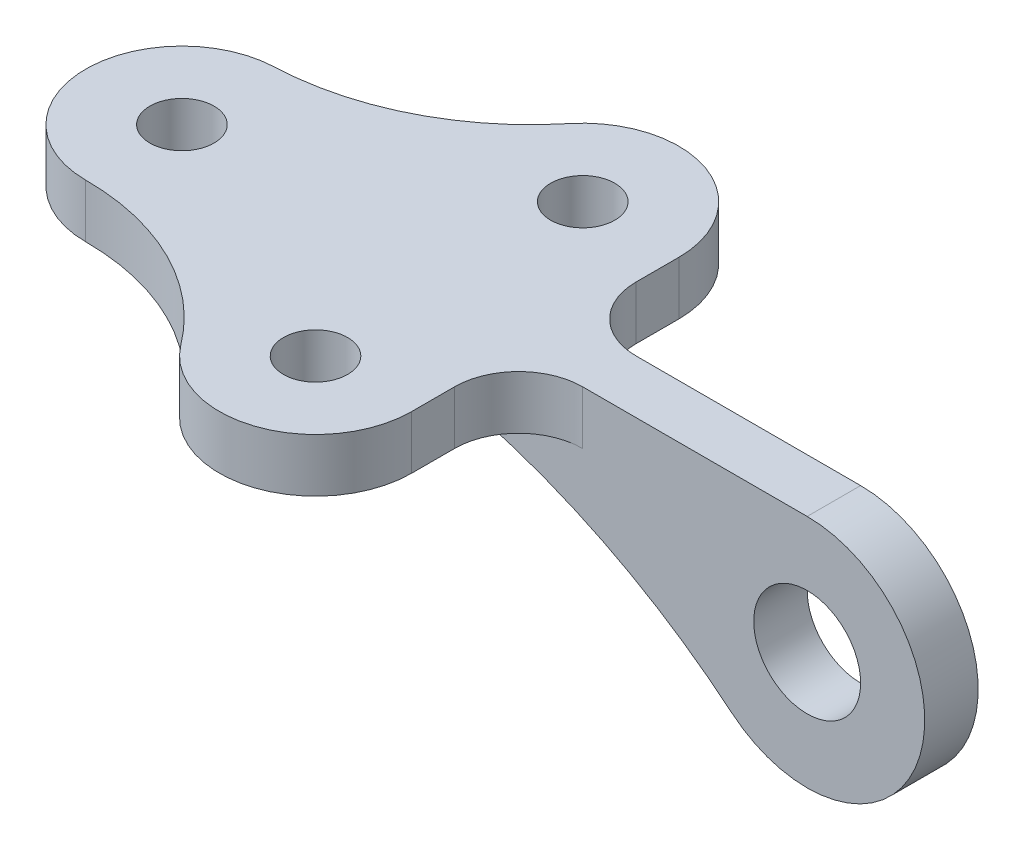
ISO-10303-21;
HEADER;
FILE_DESCRIPTION(('STEP AP214'),'2;1');
FILE_NAME('part.step','',(''),(''),'','','');
FILE_SCHEMA(('AUTOMOTIVE_DESIGN { 1 0 10303 214 1 1 1 1 }'));
ENDSEC;
DATA;
#1=APPLICATION_CONTEXT('core data for automotive mechanical design processes');
#2=APPLICATION_PROTOCOL_DEFINITION('international standard','automotive_design',2000,#1);
#3=PRODUCT_CONTEXT('',#1,'mechanical');
#4=PRODUCT('Part','Part','',(#3));
#5=PRODUCT_RELATED_PRODUCT_CATEGORY('part','',(#4));
#6=PRODUCT_DEFINITION_FORMATION('','',#4);
#7=PRODUCT_DEFINITION_CONTEXT('part definition',#1,'design');
#8=PRODUCT_DEFINITION('design','',#6,#7);
#9=PRODUCT_DEFINITION_SHAPE('','',#8);
#10=(LENGTH_UNIT() NAMED_UNIT(*) SI_UNIT(.MILLI.,.METRE.));
#11=(NAMED_UNIT(*) PLANE_ANGLE_UNIT() SI_UNIT($,.RADIAN.));
#12=(NAMED_UNIT(*) SI_UNIT($,.STERADIAN.) SOLID_ANGLE_UNIT());
#13=UNCERTAINTY_MEASURE_WITH_UNIT(LENGTH_MEASURE(1.E-05),#10,'distance_accuracy_value','');
#14=(GEOMETRIC_REPRESENTATION_CONTEXT(3) GLOBAL_UNCERTAINTY_ASSIGNED_CONTEXT((#13)) GLOBAL_UNIT_ASSIGNED_CONTEXT((#10,
#11,#12)) REPRESENTATION_CONTEXT('',''));
#15=CARTESIAN_POINT('',(0.,0.,0.));
#16=DIRECTION('',(0.,0.,1.));
#17=DIRECTION('',(1.,0.,0.));
#18=AXIS2_PLACEMENT_3D('',#15,#16,#17);
#19=CARTESIAN_POINT('',(0.,-5.,62.4999999999999));
#20=DIRECTION('',(0.,1.,0.));
#21=DIRECTION('',(0.,0.,1.));
#22=AXIS2_PLACEMENT_3D('',#19,#20,#21);
#23=PLANE('',#22);
#24=DIRECTION('',(1.,0.,0.));
#25=VECTOR('',#24,1.);
#26=CARTESIAN_POINT('',(0.,-5.,-5.));
#27=LINE('',#26,#25);
#28=CARTESIAN_POINT('',(27.9787258116547,-5.,-5.));
#29=VERTEX_POINT('',#28);
#30=CARTESIAN_POINT('',(80.,-5.,-5.));
#31=VERTEX_POINT('',#30);
#32=EDGE_CURVE('E147',#29,#31,#27,.T.);
#33=ORIENTED_EDGE('',*,*,#32,.F.);
#34=DIRECTION('',(0.,0.,1.));
#35=VECTOR('',#34,1.);
#36=CARTESIAN_POINT('',(27.9787258116547,-5.,-5.));
#37=LINE('',#36,#35);
#38=CARTESIAN_POINT('',(27.9787258116547,-5.,5.));
#39=VERTEX_POINT('',#38);
#40=EDGE_CURVE('E132',#29,#39,#37,.T.);
#41=ORIENTED_EDGE('',*,*,#40,.T.);
#42=DIRECTION('',(1.,0.,0.));
#43=VECTOR('',#42,1.);
#44=CARTESIAN_POINT('',(0.,-5.,5.));
#45=LINE('',#44,#43);
#46=CARTESIAN_POINT('',(80.,-5.,5.));
#47=VERTEX_POINT('',#46);
#48=EDGE_CURVE('E157',#39,#47,#45,.T.);
#49=ORIENTED_EDGE('',*,*,#48,.T.);
#50=CARTESIAN_POINT('',(80.,-5.,17.));
#51=DIRECTION('',(0.,1.,0.));
#52=DIRECTION('',(0.,0.,1.));
#53=AXIS2_PLACEMENT_3D('',#50,#51,#52);
#54=CIRCLE('',#53,12.);
#55=CARTESIAN_POINT('',(68.,-5.,17.));
#56=VERTEX_POINT('',#55);
#57=EDGE_CURVE('E238',#47,#56,#54,.T.);
#58=ORIENTED_EDGE('',*,*,#57,.T.);
#59=DIRECTION('',(0.,0.,-1.));
#60=VECTOR('',#59,1.);
#61=CARTESIAN_POINT('',(68.,-5.,25.));
#62=LINE('',#61,#60);
#63=CARTESIAN_POINT('',(68.,-5.,25.));
#64=VERTEX_POINT('',#63);
#65=EDGE_CURVE('E202',#64,#56,#62,.T.);
#66=ORIENTED_EDGE('',*,*,#65,.F.);
#67=CARTESIAN_POINT('',(50.,-5.,25.));
#68=DIRECTION('',(0.,1.,0.));
#69=DIRECTION('',(0.,0.,1.));
#70=AXIS2_PLACEMENT_3D('',#67,#68,#69);
#71=CIRCLE('',#70,18.);
#72=CARTESIAN_POINT('',(35.6,-5.,35.8));
#73=VERTEX_POINT('',#72);
#74=EDGE_CURVE('E199',#73,#64,#71,.T.);
#75=ORIENTED_EDGE('',*,*,#74,.F.);
#76=CARTESIAN_POINT('',(0.,-5.,62.4999999999999));
#77=DIRECTION('',(0.,-1.,0.));
#78=DIRECTION('',(0.,0.,1.));
#79=AXIS2_PLACEMENT_3D('',#76,#77,#78);
#80=CIRCLE('',#79,44.4999999999999);
#81=CARTESIAN_POINT('',(0.,-5.,18.));
#82=VERTEX_POINT('',#81);
#83=EDGE_CURVE('E177',#82,#73,#80,.T.);
#84=ORIENTED_EDGE('',*,*,#83,.F.);
#85=CARTESIAN_POINT('',(0.,-5.,0.));
#86=DIRECTION('',(0.,1.,0.));
#87=DIRECTION('',(0.,0.,1.));
#88=AXIS2_PLACEMENT_3D('',#85,#86,#87);
#89=CIRCLE('',#88,18.);
#90=CARTESIAN_POINT('',(-0.720723799290072,-5.,-17.985565245639));
#91=VERTEX_POINT('',#90);
#92=EDGE_CURVE('E184',#91,#82,#89,.T.);
#93=ORIENTED_EDGE('',*,*,#92,.F.);
#94=CARTESIAN_POINT('',(-2.72273435287363,-5.,-67.9454687057473));
#95=DIRECTION('',(0.,-1.,0.));
#96=DIRECTION('',(0.,0.,1.));
#97=AXIS2_PLACEMENT_3D('',#94,#95,#96);
#98=CIRCLE('',#97,50.);
#99=CARTESIAN_POINT('',(36.0439820830629,-5.,-36.3679181868155));
#100=VERTEX_POINT('',#99);
#101=EDGE_CURVE('E207',#100,#91,#98,.T.);
#102=ORIENTED_EDGE('',*,*,#101,.F.);
#103=CARTESIAN_POINT('',(50.,-5.,-25.));
#104=DIRECTION('',(0.,1.,0.));
#105=DIRECTION('',(0.,0.,1.));
#106=AXIS2_PLACEMENT_3D('',#103,#104,#105);
#107=CIRCLE('',#106,18.);
#108=CARTESIAN_POINT('',(68.,-5.,-25.));
#109=VERTEX_POINT('',#108);
#110=EDGE_CURVE('E205',#109,#100,#107,.T.);
#111=ORIENTED_EDGE('',*,*,#110,.F.);
#112=CARTESIAN_POINT('',(68.,-5.,-17.));
#113=VERTEX_POINT('',#112);
#114=EDGE_CURVE('E201',#113,#109,#62,.T.);
#115=ORIENTED_EDGE('',*,*,#114,.F.);
#116=CARTESIAN_POINT('',(80.,-5.,-17.));
#117=DIRECTION('',(0.,1.,0.));
#118=DIRECTION('',(0.,0.,1.));
#119=AXIS2_PLACEMENT_3D('',#116,#117,#118);
#120=CIRCLE('',#119,12.);
#121=EDGE_CURVE('E11',#113,#31,#120,.T.);
#122=ORIENTED_EDGE('',*,*,#121,.T.);
#123=EDGE_LOOP('',(#33,#41,#49,#58,#66,#75,#84,#93,#102,#111,#115,#122));
#124=FACE_BOUND('',#123,.T.);
#125=CARTESIAN_POINT('',(50.,-5.,-25.));
#126=DIRECTION('',(0.,1.,0.));
#127=DIRECTION('',(0.,0.,1.));
#128=AXIS2_PLACEMENT_3D('',#125,#126,#127);
#129=CIRCLE('',#128,6.00000000000001);
#130=CARTESIAN_POINT('',(50.,-5.,-19.));
#131=VERTEX_POINT('',#130);
#132=EDGE_CURVE('E156',#131,#131,#129,.T.);
#133=ORIENTED_EDGE('',*,*,#132,.T.);
#134=EDGE_LOOP('',(#133));
#135=FACE_BOUND('',#134,.T.);
#136=CARTESIAN_POINT('',(50.,-5.,25.));
#137=DIRECTION('',(0.,1.,0.));
#138=DIRECTION('',(0.,0.,1.));
#139=AXIS2_PLACEMENT_3D('',#136,#137,#138);
#140=CIRCLE('',#139,6.);
#141=CARTESIAN_POINT('',(50.,-5.,31.));
#142=VERTEX_POINT('',#141);
#143=EDGE_CURVE('E166',#142,#142,#140,.T.);
#144=ORIENTED_EDGE('',*,*,#143,.T.);
#145=EDGE_LOOP('',(#144));
#146=FACE_BOUND('',#145,.T.);
#147=CARTESIAN_POINT('',(0.,-5.,0.));
#148=DIRECTION('',(0.,1.,0.));
#149=DIRECTION('',(0.,0.,1.));
#150=AXIS2_PLACEMENT_3D('',#147,#148,#149);
#151=CIRCLE('',#150,6.);
#152=CARTESIAN_POINT('',(0.,-5.,6.));
#153=VERTEX_POINT('',#152);
#154=EDGE_CURVE('E171',#153,#153,#151,.T.);
#155=ORIENTED_EDGE('',*,*,#154,.T.);
#156=EDGE_LOOP('',(#155));
#157=FACE_BOUND('',#156,.T.);
#158=ADVANCED_FACE('F37',(#124,#135,#146,#157),#23,.F.);
#159=CARTESIAN_POINT('',(68.,5.,25.));
#160=DIRECTION('',(-1.,0.,0.));
#161=DIRECTION('',(0.,0.,1.));
#162=AXIS2_PLACEMENT_3D('',#159,#160,#161);
#163=PLANE('',#162);
#164=DIRECTION('',(0.,0.,-1.));
#165=VECTOR('',#164,1.);
#166=CARTESIAN_POINT('',(68.,5.,25.));
#167=LINE('',#166,#165);
#168=CARTESIAN_POINT('',(68.,5.,-17.));
#169=VERTEX_POINT('',#168);
#170=CARTESIAN_POINT('',(68.,5.,-25.));
#171=VERTEX_POINT('',#170);
#172=EDGE_CURVE('E186',#169,#171,#167,.T.);
#173=ORIENTED_EDGE('',*,*,#172,.F.);
#174=DIRECTION('',(0.,1.,0.));
#175=VECTOR('',#174,1.);
#176=CARTESIAN_POINT('',(68.,-5.,-17.));
#177=LINE('',#176,#175);
#178=EDGE_CURVE('E58',#169,#113,#177,.F.);
#179=ORIENTED_EDGE('',*,*,#178,.T.);
#180=ORIENTED_EDGE('',*,*,#114,.T.);
#181=DIRECTION('',(0.,-1.,0.));
#182=VECTOR('',#181,1.);
#183=CARTESIAN_POINT('',(68.,5.,-25.));
#184=LINE('',#183,#182);
#185=EDGE_CURVE('E218',#171,#109,#184,.T.);
#186=ORIENTED_EDGE('',*,*,#185,.F.);
#187=EDGE_LOOP('',(#173,#179,#180,#186));
#188=FACE_BOUND('',#187,.T.);
#189=ADVANCED_FACE('F288',(#188),#163,.F.);
#190=CARTESIAN_POINT('',(0.,5.,62.4999999999999));
#191=DIRECTION('',(0.,1.,0.));
#192=DIRECTION('',(0.,0.,1.));
#193=AXIS2_PLACEMENT_3D('',#190,#191,#192);
#194=PLANE('',#193);
#195=DIRECTION('',(-1.,0.,0.));
#196=VECTOR('',#195,1.);
#197=CARTESIAN_POINT('',(12.,5.,-5.));
#198=LINE('',#197,#196);
#199=CARTESIAN_POINT('',(122.,5.,-5.));
#200=VERTEX_POINT('',#199);
#201=CARTESIAN_POINT('',(80.,5.,-5.));
#202=VERTEX_POINT('',#201);
#203=EDGE_CURVE('E141',#200,#202,#198,.T.);
#204=ORIENTED_EDGE('',*,*,#203,.T.);
#205=CARTESIAN_POINT('',(80.,5.,-17.));
#206=DIRECTION('',(0.,1.,0.));
#207=DIRECTION('',(0.,0.,1.));
#208=AXIS2_PLACEMENT_3D('',#205,#206,#207);
#209=CIRCLE('',#208,12.);
#210=EDGE_CURVE('E45',#202,#169,#209,.F.);
#211=ORIENTED_EDGE('',*,*,#210,.T.);
#212=ORIENTED_EDGE('',*,*,#172,.T.);
#213=CARTESIAN_POINT('',(50.,5.,-25.));
#214=DIRECTION('',(0.,1.,0.));
#215=DIRECTION('',(0.,0.,1.));
#216=AXIS2_PLACEMENT_3D('',#213,#214,#215);
#217=CIRCLE('',#216,18.);
#218=CARTESIAN_POINT('',(36.0439820830629,5.,-36.3679181868155));
#219=VERTEX_POINT('',#218);
#220=EDGE_CURVE('E190',#171,#219,#217,.T.);
#221=ORIENTED_EDGE('',*,*,#220,.T.);
#222=CARTESIAN_POINT('',(-2.72273435287363,5.,-67.9454687057473));
#223=DIRECTION('',(0.,-1.,0.));
#224=DIRECTION('',(0.,0.,1.));
#225=AXIS2_PLACEMENT_3D('',#222,#223,#224);
#226=CIRCLE('',#225,50.);
#227=CARTESIAN_POINT('',(-0.720723799290072,5.,-17.985565245639));
#228=VERTEX_POINT('',#227);
#229=EDGE_CURVE('E192',#219,#228,#226,.T.);
#230=ORIENTED_EDGE('',*,*,#229,.T.);
#231=CARTESIAN_POINT('',(0.,5.,0.));
#232=DIRECTION('',(0.,1.,0.));
#233=DIRECTION('',(0.,0.,1.));
#234=AXIS2_PLACEMENT_3D('',#231,#232,#233);
#235=CIRCLE('',#234,18.);
#236=CARTESIAN_POINT('',(0.,5.,18.));
#237=VERTEX_POINT('',#236);
#238=EDGE_CURVE('E194',#228,#237,#235,.T.);
#239=ORIENTED_EDGE('',*,*,#238,.T.);
#240=CARTESIAN_POINT('',(0.,5.,62.4999999999999));
#241=DIRECTION('',(0.,-1.,0.));
#242=DIRECTION('',(0.,0.,1.));
#243=AXIS2_PLACEMENT_3D('',#240,#241,#242);
#244=CIRCLE('',#243,44.4999999999999);
#245=CARTESIAN_POINT('',(35.6,5.,35.8));
#246=VERTEX_POINT('',#245);
#247=EDGE_CURVE('E180',#237,#246,#244,.T.);
#248=ORIENTED_EDGE('',*,*,#247,.T.);
#249=CARTESIAN_POINT('',(50.,5.,25.));
#250=DIRECTION('',(0.,1.,0.));
#251=DIRECTION('',(0.,0.,1.));
#252=AXIS2_PLACEMENT_3D('',#249,#250,#251);
#253=CIRCLE('',#252,18.);
#254=CARTESIAN_POINT('',(68.,5.,25.));
#255=VERTEX_POINT('',#254);
#256=EDGE_CURVE('E183',#246,#255,#253,.T.);
#257=ORIENTED_EDGE('',*,*,#256,.T.);
#258=CARTESIAN_POINT('',(68.,5.,17.));
#259=VERTEX_POINT('',#258);
#260=EDGE_CURVE('E187',#255,#259,#167,.T.);
#261=ORIENTED_EDGE('',*,*,#260,.T.);
#262=CARTESIAN_POINT('',(80.,5.,17.));
#263=DIRECTION('',(0.,1.,0.));
#264=DIRECTION('',(0.,0.,1.));
#265=AXIS2_PLACEMENT_3D('',#262,#263,#264);
#266=CIRCLE('',#265,12.);
#267=CARTESIAN_POINT('',(80.,5.,5.));
#268=VERTEX_POINT('',#267);
#269=EDGE_CURVE('E236',#259,#268,#266,.F.);
#270=ORIENTED_EDGE('',*,*,#269,.T.);
#271=DIRECTION('',(-1.,0.,0.));
#272=VECTOR('',#271,1.);
#273=CARTESIAN_POINT('',(12.,5.,5.));
#274=LINE('',#273,#272);
#275=CARTESIAN_POINT('',(122.,5.,5.));
#276=VERTEX_POINT('',#275);
#277=EDGE_CURVE('E151',#276,#268,#274,.T.);
#278=ORIENTED_EDGE('',*,*,#277,.F.);
#279=DIRECTION('',(0.,0.,1.));
#280=VECTOR('',#279,1.);
#281=CARTESIAN_POINT('',(122.,5.,-5.));
#282=LINE('',#281,#280);
#283=EDGE_CURVE('E162',#200,#276,#282,.T.);
#284=ORIENTED_EDGE('',*,*,#283,.F.);
#285=EDGE_LOOP('',(#204,#211,#212,#221,#230,#239,#248,#257,#261,#270,#278,#284));
#286=FACE_BOUND('',#285,.T.);
#287=CARTESIAN_POINT('',(50.,5.,25.));
#288=DIRECTION('',(0.,1.,0.));
#289=DIRECTION('',(0.,0.,1.));
#290=AXIS2_PLACEMENT_3D('',#287,#288,#289);
#291=CIRCLE('',#290,6.);
#292=CARTESIAN_POINT('',(50.,5.,31.));
#293=VERTEX_POINT('',#292);
#294=EDGE_CURVE('E168',#293,#293,#291,.T.);
#295=ORIENTED_EDGE('',*,*,#294,.F.);
#296=EDGE_LOOP('',(#295));
#297=FACE_BOUND('',#296,.T.);
#298=CARTESIAN_POINT('',(0.,5.,0.));
#299=DIRECTION('',(0.,1.,0.));
#300=DIRECTION('',(0.,0.,1.));
#301=AXIS2_PLACEMENT_3D('',#298,#299,#300);
#302=CIRCLE('',#301,6.);
#303=CARTESIAN_POINT('',(0.,5.,6.));
#304=VERTEX_POINT('',#303);
#305=EDGE_CURVE('E174',#304,#304,#302,.T.);
#306=ORIENTED_EDGE('',*,*,#305,.F.);
#307=EDGE_LOOP('',(#306));
#308=FACE_BOUND('',#307,.T.);
#309=CARTESIAN_POINT('',(50.,5.,-25.));
#310=DIRECTION('',(0.,1.,0.));
#311=DIRECTION('',(0.,0.,1.));
#312=AXIS2_PLACEMENT_3D('',#309,#310,#311);
#313=CIRCLE('',#312,6.00000000000001);
#314=CARTESIAN_POINT('',(50.,5.,-19.));
#315=VERTEX_POINT('',#314);
#316=EDGE_CURVE('E160',#315,#315,#313,.T.);
#317=ORIENTED_EDGE('',*,*,#316,.F.);
#318=EDGE_LOOP('',(#317));
#319=FACE_BOUND('',#318,.T.);
#320=ADVANCED_FACE('F251',(#286,#297,#308,#319),#194,.T.);
#321=CARTESIAN_POINT('',(0.,5.,62.4999999999999));
#322=DIRECTION('',(0.,-1.,0.));
#323=DIRECTION('',(0.,0.,-1.));
#324=AXIS2_PLACEMENT_3D('',#321,#322,#323);
#325=CYLINDRICAL_SURFACE('',#324,44.4999999999999);
#326=ORIENTED_EDGE('',*,*,#83,.T.);
#327=DIRECTION('',(0.,-1.,0.));
#328=VECTOR('',#327,1.);
#329=CARTESIAN_POINT('',(35.6,5.,35.8));
#330=LINE('',#329,#328);
#331=EDGE_CURVE('E224',#246,#73,#330,.T.);
#332=ORIENTED_EDGE('',*,*,#331,.F.);
#333=ORIENTED_EDGE('',*,*,#247,.F.);
#334=DIRECTION('',(0.,-1.,0.));
#335=VECTOR('',#334,1.);
#336=CARTESIAN_POINT('',(0.,5.,18.));
#337=LINE('',#336,#335);
#338=EDGE_CURVE('E196',#237,#82,#337,.T.);
#339=ORIENTED_EDGE('',*,*,#338,.T.);
#340=EDGE_LOOP('',(#326,#332,#333,#339));
#341=FACE_BOUND('',#340,.T.);
#342=ADVANCED_FACE('F314',(#341),#325,.F.);
#343=CARTESIAN_POINT('',(50.,5.,25.));
#344=DIRECTION('',(0.,-1.,0.));
#345=DIRECTION('',(0.,0.,-1.));
#346=AXIS2_PLACEMENT_3D('',#343,#344,#345);
#347=CYLINDRICAL_SURFACE('',#346,18.);
#348=ORIENTED_EDGE('',*,*,#74,.T.);
#349=DIRECTION('',(0.,-1.,0.));
#350=VECTOR('',#349,1.);
#351=CARTESIAN_POINT('',(68.,5.,25.));
#352=LINE('',#351,#350);
#353=EDGE_CURVE('E221',#255,#64,#352,.T.);
#354=ORIENTED_EDGE('',*,*,#353,.F.);
#355=ORIENTED_EDGE('',*,*,#256,.F.);
#356=ORIENTED_EDGE('',*,*,#331,.T.);
#357=EDGE_LOOP('',(#348,#354,#355,#356));
#358=FACE_BOUND('',#357,.T.);
#359=ADVANCED_FACE('F311',(#358),#347,.T.);
#360=ORIENTED_EDGE('',*,*,#65,.T.);
#361=DIRECTION('',(0.,1.,0.));
#362=VECTOR('',#361,1.);
#363=CARTESIAN_POINT('',(68.,5.,17.));
#364=LINE('',#363,#362);
#365=EDGE_CURVE('E227',#56,#259,#364,.T.);
#366=ORIENTED_EDGE('',*,*,#365,.T.);
#367=ORIENTED_EDGE('',*,*,#260,.F.);
#368=ORIENTED_EDGE('',*,*,#353,.T.);
#369=EDGE_LOOP('',(#360,#366,#367,#368));
#370=FACE_BOUND('',#369,.T.);
#371=ADVANCED_FACE('F245',(#370),#163,.F.);
#372=CARTESIAN_POINT('',(50.,5.,-25.));
#373=DIRECTION('',(0.,-1.,0.));
#374=DIRECTION('',(0.,0.,-1.));
#375=AXIS2_PLACEMENT_3D('',#372,#373,#374);
#376=CYLINDRICAL_SURFACE('',#375,18.);
#377=ORIENTED_EDGE('',*,*,#110,.T.);
#378=DIRECTION('',(0.,-1.,0.));
#379=VECTOR('',#378,1.);
#380=CARTESIAN_POINT('',(36.0439820830629,5.,-36.3679181868155));
#381=LINE('',#380,#379);
#382=EDGE_CURVE('E215',#219,#100,#381,.T.);
#383=ORIENTED_EDGE('',*,*,#382,.F.);
#384=ORIENTED_EDGE('',*,*,#220,.F.);
#385=ORIENTED_EDGE('',*,*,#185,.T.);
#386=EDGE_LOOP('',(#377,#383,#384,#385));
#387=FACE_BOUND('',#386,.T.);
#388=ADVANCED_FACE('F305',(#387),#376,.T.);
#389=CARTESIAN_POINT('',(-2.72273435287363,5.,-67.9454687057473));
#390=DIRECTION('',(0.,-1.,0.));
#391=DIRECTION('',(0.,0.,-1.));
#392=AXIS2_PLACEMENT_3D('',#389,#390,#391);
#393=CYLINDRICAL_SURFACE('',#392,50.);
#394=ORIENTED_EDGE('',*,*,#101,.T.);
#395=DIRECTION('',(0.,-1.,0.));
#396=VECTOR('',#395,1.);
#397=CARTESIAN_POINT('',(-0.720723799290072,5.,-17.985565245639));
#398=LINE('',#397,#396);
#399=EDGE_CURVE('E212',#228,#91,#398,.T.);
#400=ORIENTED_EDGE('',*,*,#399,.F.);
#401=ORIENTED_EDGE('',*,*,#229,.F.);
#402=ORIENTED_EDGE('',*,*,#382,.T.);
#403=EDGE_LOOP('',(#394,#400,#401,#402));
#404=FACE_BOUND('',#403,.T.);
#405=ADVANCED_FACE('F301',(#404),#393,.F.);
#406=CARTESIAN_POINT('',(0.,5.,0.));
#407=DIRECTION('',(0.,-1.,0.));
#408=DIRECTION('',(0.,0.,-1.));
#409=AXIS2_PLACEMENT_3D('',#406,#407,#408);
#410=CYLINDRICAL_SURFACE('',#409,18.);
#411=ORIENTED_EDGE('',*,*,#92,.T.);
#412=ORIENTED_EDGE('',*,*,#338,.F.);
#413=ORIENTED_EDGE('',*,*,#238,.F.);
#414=ORIENTED_EDGE('',*,*,#399,.T.);
#415=EDGE_LOOP('',(#411,#412,#413,#414));
#416=FACE_BOUND('',#415,.T.);
#417=ADVANCED_FACE('F297',(#416),#410,.T.);
#418=CARTESIAN_POINT('',(0.,5.,0.));
#419=DIRECTION('',(0.,-1.,0.));
#420=DIRECTION('',(0.,0.,-1.));
#421=AXIS2_PLACEMENT_3D('',#418,#419,#420);
#422=CYLINDRICAL_SURFACE('',#421,6.);
#423=ORIENTED_EDGE('',*,*,#305,.T.);
#424=EDGE_LOOP('',(#423));
#425=FACE_BOUND('',#424,.T.);
#426=ORIENTED_EDGE('',*,*,#154,.F.);
#427=EDGE_LOOP('',(#426));
#428=FACE_BOUND('',#427,.T.);
#429=ADVANCED_FACE('F300',(#425,#428),#422,.F.);
#430=CARTESIAN_POINT('',(50.,5.,25.));
#431=DIRECTION('',(0.,-1.,0.));
#432=DIRECTION('',(0.,0.,-1.));
#433=AXIS2_PLACEMENT_3D('',#430,#431,#432);
#434=CYLINDRICAL_SURFACE('',#433,6.);
#435=ORIENTED_EDGE('',*,*,#294,.T.);
#436=EDGE_LOOP('',(#435));
#437=FACE_BOUND('',#436,.T.);
#438=ORIENTED_EDGE('',*,*,#143,.F.);
#439=EDGE_LOOP('',(#438));
#440=FACE_BOUND('',#439,.T.);
#441=ADVANCED_FACE('F336',(#437,#440),#434,.F.);
#442=CARTESIAN_POINT('',(50.,5.,-25.));
#443=DIRECTION('',(0.,-1.,0.));
#444=DIRECTION('',(0.,0.,-1.));
#445=AXIS2_PLACEMENT_3D('',#442,#443,#444);
#446=CYLINDRICAL_SURFACE('',#445,6.00000000000001);
#447=ORIENTED_EDGE('',*,*,#316,.T.);
#448=EDGE_LOOP('',(#447));
#449=FACE_BOUND('',#448,.T.);
#450=ORIENTED_EDGE('',*,*,#132,.F.);
#451=EDGE_LOOP('',(#450));
#452=FACE_BOUND('',#451,.T.);
#453=ADVANCED_FACE('F284',(#449,#452),#446,.F.);
#454=CARTESIAN_POINT('',(27.9787258116547,-130.,-5.));
#455=DIRECTION('',(0.,0.,1.));
#456=DIRECTION('',(1.,0.,0.));
#457=AXIS2_PLACEMENT_3D('',#454,#455,#456);
#458=PLANE('',#457);
#459=CARTESIAN_POINT('',(122.,-17.,-5.));
#460=DIRECTION('',(0.,0.,1.));
#461=DIRECTION('',(1.,0.,0.));
#462=AXIS2_PLACEMENT_3D('',#459,#460,#461);
#463=CIRCLE('',#462,10.);
#464=CARTESIAN_POINT('',(132.,-17.,-5.));
#465=VERTEX_POINT('',#464);
#466=EDGE_CURVE('E265',#465,#465,#463,.T.);
#467=ORIENTED_EDGE('',*,*,#466,.T.);
#468=EDGE_LOOP('',(#467));
#469=FACE_BOUND('',#468,.T.);
#470=ORIENTED_EDGE('',*,*,#32,.T.);
#471=DIRECTION('',(0.,1.,0.));
#472=VECTOR('',#471,1.);
#473=CARTESIAN_POINT('',(80.,5.,-5.));
#474=LINE('',#473,#472);
#475=EDGE_CURVE('E233',#31,#202,#474,.T.);
#476=ORIENTED_EDGE('',*,*,#475,.T.);
#477=ORIENTED_EDGE('',*,*,#203,.F.);
#478=CARTESIAN_POINT('',(122.,-17.,-5.));
#479=DIRECTION('',(0.,0.,1.));
#480=DIRECTION('',(1.,0.,0.));
#481=AXIS2_PLACEMENT_3D('',#478,#479,#480);
#482=CIRCLE('',#481,22.);
#483=CARTESIAN_POINT('',(107.928788896982,-33.9115646258503,-5.));
#484=VERTEX_POINT('',#483);
#485=EDGE_CURVE('E150',#484,#200,#482,.T.);
#486=ORIENTED_EDGE('',*,*,#485,.F.);
#487=CARTESIAN_POINT('',(27.9787258116547,-130.,-5.));
#488=DIRECTION('',(0.,0.,-1.));
#489=DIRECTION('',(1.,0.,0.));
#490=AXIS2_PLACEMENT_3D('',#487,#488,#489);
#491=CIRCLE('',#490,125.);
#492=EDGE_CURVE('E135',#29,#484,#491,.T.);
#493=ORIENTED_EDGE('',*,*,#492,.F.);
#494=EDGE_LOOP('',(#470,#476,#477,#486,#493));
#495=FACE_BOUND('',#494,.T.);
#496=ADVANCED_FACE('F145',(#469,#495),#458,.F.);
#497=CARTESIAN_POINT('',(27.9787258116547,-130.,5.));
#498=DIRECTION('',(0.,0.,1.));
#499=DIRECTION('',(1.,0.,0.));
#500=AXIS2_PLACEMENT_3D('',#497,#498,#499);
#501=PLANE('',#500);
#502=CARTESIAN_POINT('',(122.,-17.,5.));
#503=DIRECTION('',(0.,0.,1.));
#504=DIRECTION('',(1.,0.,0.));
#505=AXIS2_PLACEMENT_3D('',#502,#503,#504);
#506=CIRCLE('',#505,10.);
#507=CARTESIAN_POINT('',(132.,-17.,5.));
#508=VERTEX_POINT('',#507);
#509=EDGE_CURVE('E267',#508,#508,#506,.T.);
#510=ORIENTED_EDGE('',*,*,#509,.F.);
#511=EDGE_LOOP('',(#510));
#512=FACE_BOUND('',#511,.T.);
#513=ORIENTED_EDGE('',*,*,#277,.T.);
#514=DIRECTION('',(0.,1.,0.));
#515=VECTOR('',#514,1.);
#516=CARTESIAN_POINT('',(80.,-130.,5.));
#517=LINE('',#516,#515);
#518=EDGE_CURVE('E230',#268,#47,#517,.F.);
#519=ORIENTED_EDGE('',*,*,#518,.T.);
#520=ORIENTED_EDGE('',*,*,#48,.F.);
#521=CARTESIAN_POINT('',(27.9787258116547,-130.,5.));
#522=DIRECTION('',(0.,0.,-1.));
#523=DIRECTION('',(1.,0.,0.));
#524=AXIS2_PLACEMENT_3D('',#521,#522,#523);
#525=CIRCLE('',#524,125.);
#526=CARTESIAN_POINT('',(107.928788896982,-33.9115646258503,5.));
#527=VERTEX_POINT('',#526);
#528=EDGE_CURVE('E137',#39,#527,#525,.T.);
#529=ORIENTED_EDGE('',*,*,#528,.T.);
#530=CARTESIAN_POINT('',(122.,-17.,5.));
#531=DIRECTION('',(0.,0.,1.));
#532=DIRECTION('',(1.,0.,0.));
#533=AXIS2_PLACEMENT_3D('',#530,#531,#532);
#534=CIRCLE('',#533,22.);
#535=EDGE_CURVE('E257',#527,#276,#534,.T.);
#536=ORIENTED_EDGE('',*,*,#535,.T.);
#537=EDGE_LOOP('',(#513,#519,#520,#529,#536));
#538=FACE_BOUND('',#537,.T.);
#539=ADVANCED_FACE('F255',(#512,#538),#501,.T.);
#540=CARTESIAN_POINT('',(122.,-17.,-5.));
#541=DIRECTION('',(0.,0.,1.));
#542=DIRECTION('',(1.,0.,0.));
#543=AXIS2_PLACEMENT_3D('',#540,#541,#542);
#544=CYLINDRICAL_SURFACE('',#543,22.);
#545=ORIENTED_EDGE('',*,*,#535,.F.);
#546=DIRECTION('',(0.,0.,1.));
#547=VECTOR('',#546,1.);
#548=CARTESIAN_POINT('',(107.928788896982,-33.9115646258503,-5.));
#549=LINE('',#548,#547);
#550=EDGE_CURVE('E140',#484,#527,#549,.T.);
#551=ORIENTED_EDGE('',*,*,#550,.F.);
#552=ORIENTED_EDGE('',*,*,#485,.T.);
#553=ORIENTED_EDGE('',*,*,#283,.T.);
#554=EDGE_LOOP('',(#545,#551,#552,#553));
#555=FACE_BOUND('',#554,.T.);
#556=ADVANCED_FACE('F264',(#555),#544,.T.);
#557=CARTESIAN_POINT('',(27.9787258116547,-130.,-5.));
#558=DIRECTION('',(0.,0.,1.));
#559=DIRECTION('',(1.,0.,0.));
#560=AXIS2_PLACEMENT_3D('',#557,#558,#559);
#561=CYLINDRICAL_SURFACE('',#560,125.);
#562=ORIENTED_EDGE('',*,*,#528,.F.);
#563=ORIENTED_EDGE('',*,*,#40,.F.);
#564=ORIENTED_EDGE('',*,*,#492,.T.);
#565=ORIENTED_EDGE('',*,*,#550,.T.);
#566=EDGE_LOOP('',(#562,#563,#564,#565));
#567=FACE_BOUND('',#566,.T.);
#568=ADVANCED_FACE('F134',(#567),#561,.F.);
#569=CARTESIAN_POINT('',(122.,-17.,-5.));
#570=DIRECTION('',(0.,0.,1.));
#571=DIRECTION('',(1.,0.,0.));
#572=AXIS2_PLACEMENT_3D('',#569,#570,#571);
#573=CYLINDRICAL_SURFACE('',#572,10.);
#574=ORIENTED_EDGE('',*,*,#466,.F.);
#575=EDGE_LOOP('',(#574));
#576=FACE_BOUND('',#575,.T.);
#577=ORIENTED_EDGE('',*,*,#509,.T.);
#578=EDGE_LOOP('',(#577));
#579=FACE_BOUND('',#578,.T.);
#580=ADVANCED_FACE('F275',(#576,#579),#573,.F.);
#581=CARTESIAN_POINT('',(80.,5.,17.));
#582=DIRECTION('',(0.,1.,0.));
#583=DIRECTION('',(0.,0.,1.));
#584=AXIS2_PLACEMENT_3D('',#581,#582,#583);
#585=CYLINDRICAL_SURFACE('',#584,12.);
#586=ORIENTED_EDGE('',*,*,#57,.F.);
#587=ORIENTED_EDGE('',*,*,#518,.F.);
#588=ORIENTED_EDGE('',*,*,#269,.F.);
#589=ORIENTED_EDGE('',*,*,#365,.F.);
#590=EDGE_LOOP('',(#586,#587,#588,#589));
#591=FACE_BOUND('',#590,.T.);
#592=ADVANCED_FACE('F248',(#591),#585,.F.);
#593=CARTESIAN_POINT('',(80.,-130.,-17.));
#594=DIRECTION('',(0.,-1.,0.));
#595=DIRECTION('',(0.,0.,-1.));
#596=AXIS2_PLACEMENT_3D('',#593,#594,#595);
#597=CYLINDRICAL_SURFACE('',#596,12.);
#598=ORIENTED_EDGE('',*,*,#121,.F.);
#599=ORIENTED_EDGE('',*,*,#178,.F.);
#600=ORIENTED_EDGE('',*,*,#210,.F.);
#601=ORIENTED_EDGE('',*,*,#475,.F.);
#602=EDGE_LOOP('',(#598,#599,#600,#601));
#603=FACE_BOUND('',#602,.T.);
#604=ADVANCED_FACE('F39',(#603),#597,.F.);
#605=CLOSED_SHELL('',(#158,#189,#320,#342,#359,#371,#388,#405,#417,#429,#441,#453,#496,#539,
#556,#568,#580,#592,#604));
#606=MANIFOLD_SOLID_BREP('B2',#605);
#607=ADVANCED_BREP_SHAPE_REPRESENTATION('',(#18,#606),#14);
#608=SHAPE_DEFINITION_REPRESENTATION(#9,#607);
ENDSEC;
END-ISO-10303-21;
